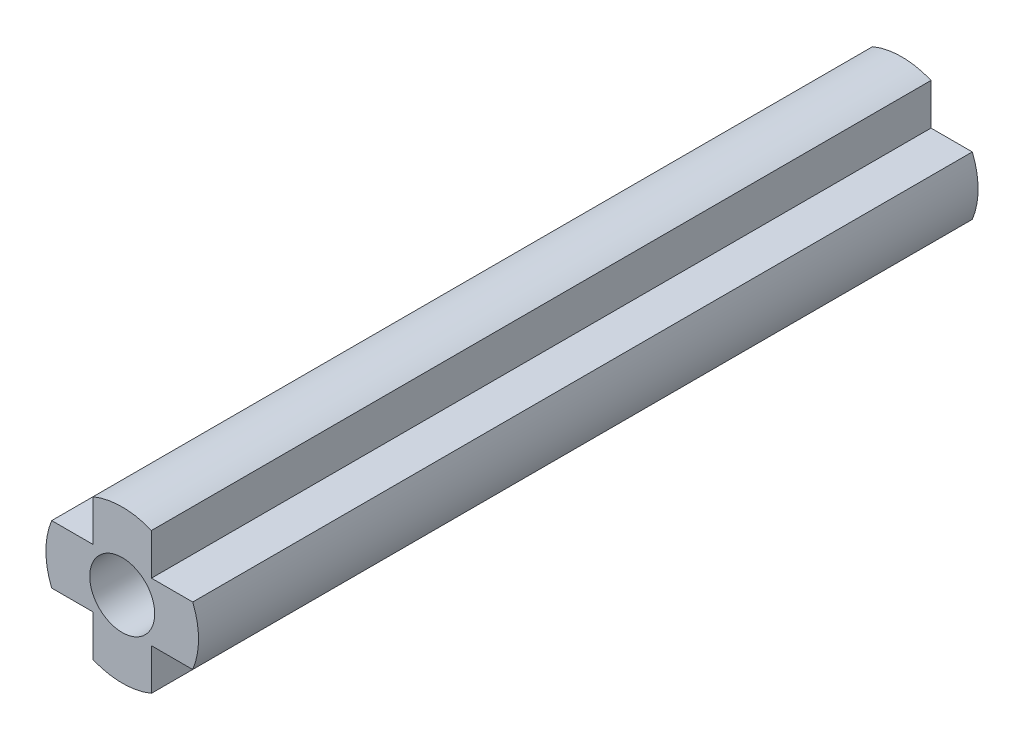
ISO-10303-21;
HEADER;
FILE_DESCRIPTION(('STEP AP214'),'2;1');
FILE_NAME('part.step','',(''),(''),'','','');
FILE_SCHEMA(('AUTOMOTIVE_DESIGN { 1 0 10303 214 1 1 1 1 }'));
ENDSEC;
DATA;
#1=APPLICATION_CONTEXT('core data for automotive mechanical design processes');
#2=APPLICATION_PROTOCOL_DEFINITION('international standard','automotive_design',2000,#1);
#3=PRODUCT_CONTEXT('',#1,'mechanical');
#4=PRODUCT('Part','Part','',(#3));
#5=PRODUCT_RELATED_PRODUCT_CATEGORY('part','',(#4));
#6=PRODUCT_DEFINITION_FORMATION('','',#4);
#7=PRODUCT_DEFINITION_CONTEXT('part definition',#1,'design');
#8=PRODUCT_DEFINITION('design','',#6,#7);
#9=PRODUCT_DEFINITION_SHAPE('','',#8);
#10=(LENGTH_UNIT() NAMED_UNIT(*) SI_UNIT(.MILLI.,.METRE.));
#11=(NAMED_UNIT(*) PLANE_ANGLE_UNIT() SI_UNIT($,.RADIAN.));
#12=(NAMED_UNIT(*) SI_UNIT($,.STERADIAN.) SOLID_ANGLE_UNIT());
#13=UNCERTAINTY_MEASURE_WITH_UNIT(LENGTH_MEASURE(1.E-05),#10,'distance_accuracy_value','');
#14=(GEOMETRIC_REPRESENTATION_CONTEXT(3) GLOBAL_UNCERTAINTY_ASSIGNED_CONTEXT((#13)) GLOBAL_UNIT_ASSIGNED_CONTEXT((#10,
#11,#12)) REPRESENTATION_CONTEXT('',''));
#15=CARTESIAN_POINT('',(0.,0.,0.));
#16=DIRECTION('',(0.,0.,1.));
#17=DIRECTION('',(1.,0.,0.));
#18=AXIS2_PLACEMENT_3D('',#15,#16,#17);
#19=CARTESIAN_POINT('',(-2.17082933460924,0.9,24.));
#20=DIRECTION('',(0.,-1.,0.));
#21=DIRECTION('',(0.,0.,-1.));
#22=AXIS2_PLACEMENT_3D('',#19,#20,#21);
#23=PLANE('',#22);
#24=DIRECTION('',(-1.,0.,0.));
#25=VECTOR('',#24,1.);
#26=CARTESIAN_POINT('',(-2.17082933460924,0.9,0.));
#27=LINE('',#26,#25);
#28=CARTESIAN_POINT('',(-0.9,0.9,0.));
#29=VERTEX_POINT('',#28);
#30=CARTESIAN_POINT('',(-2.17082933460924,0.9,0.));
#31=VERTEX_POINT('',#30);
#32=EDGE_CURVE('E153',#29,#31,#27,.T.);
#33=ORIENTED_EDGE('',*,*,#32,.T.);
#34=DIRECTION('',(0.,0.,-1.));
#35=VECTOR('',#34,1.);
#36=CARTESIAN_POINT('',(-2.17082933460924,0.9,24.));
#37=LINE('',#36,#35);
#38=CARTESIAN_POINT('',(-2.17082933460924,0.9,24.));
#39=VERTEX_POINT('',#38);
#40=EDGE_CURVE('E11',#39,#31,#37,.T.);
#41=ORIENTED_EDGE('',*,*,#40,.F.);
#42=DIRECTION('',(-1.,0.,0.));
#43=VECTOR('',#42,1.);
#44=CARTESIAN_POINT('',(-2.17082933460924,0.9,24.));
#45=LINE('',#44,#43);
#46=CARTESIAN_POINT('',(-0.9,0.9,24.));
#47=VERTEX_POINT('',#46);
#48=EDGE_CURVE('E176',#47,#39,#45,.T.);
#49=ORIENTED_EDGE('',*,*,#48,.F.);
#50=DIRECTION('',(0.,0.,-1.));
#51=VECTOR('',#50,1.);
#52=CARTESIAN_POINT('',(-0.9,0.9,24.));
#53=LINE('',#52,#51);
#54=EDGE_CURVE('E149',#47,#29,#53,.T.);
#55=ORIENTED_EDGE('',*,*,#54,.T.);
#56=EDGE_LOOP('',(#33,#41,#49,#55));
#57=FACE_BOUND('',#56,.T.);
#58=ADVANCED_FACE('F33',(#57),#23,.F.);
#59=CARTESIAN_POINT('',(0.,0.,24.));
#60=DIRECTION('',(0.,0.,-1.));
#61=DIRECTION('',(-1.,0.,0.));
#62=AXIS2_PLACEMENT_3D('',#59,#60,#61);
#63=CYLINDRICAL_SURFACE('',#62,2.35);
#64=CARTESIAN_POINT('',(0.,0.,0.));
#65=DIRECTION('',(0.,0.,1.));
#66=DIRECTION('',(1.,0.,0.));
#67=AXIS2_PLACEMENT_3D('',#64,#65,#66);
#68=CIRCLE('',#67,2.35);
#69=CARTESIAN_POINT('',(-2.17082933460924,-0.9,0.));
#70=VERTEX_POINT('',#69);
#71=EDGE_CURVE('E156',#31,#70,#68,.T.);
#72=ORIENTED_EDGE('',*,*,#71,.T.);
#73=DIRECTION('',(0.,0.,-1.));
#74=VECTOR('',#73,1.);
#75=CARTESIAN_POINT('',(-2.17082933460924,-0.9,24.));
#76=LINE('',#75,#74);
#77=CARTESIAN_POINT('',(-2.17082933460924,-0.9,24.));
#78=VERTEX_POINT('',#77);
#79=EDGE_CURVE('E41',#78,#70,#76,.T.);
#80=ORIENTED_EDGE('',*,*,#79,.F.);
#81=CARTESIAN_POINT('',(0.,0.,24.));
#82=DIRECTION('',(0.,0.,1.));
#83=DIRECTION('',(1.,0.,0.));
#84=AXIS2_PLACEMENT_3D('',#81,#82,#83);
#85=CIRCLE('',#84,2.35);
#86=EDGE_CURVE('E104',#39,#78,#85,.T.);
#87=ORIENTED_EDGE('',*,*,#86,.F.);
#88=ORIENTED_EDGE('',*,*,#40,.T.);
#89=EDGE_LOOP('',(#72,#80,#87,#88));
#90=FACE_BOUND('',#89,.T.);
#91=ADVANCED_FACE('F255',(#90),#63,.T.);
#92=CARTESIAN_POINT('',(-2.17082933460924,-0.9,24.));
#93=DIRECTION('',(0.,1.,0.));
#94=DIRECTION('',(-1.,0.,0.));
#95=AXIS2_PLACEMENT_3D('',#92,#93,#94);
#96=PLANE('',#95);
#97=DIRECTION('',(1.,0.,0.));
#98=VECTOR('',#97,1.);
#99=CARTESIAN_POINT('',(-2.17082933460924,-0.9,0.));
#100=LINE('',#99,#98);
#101=CARTESIAN_POINT('',(-0.9,-0.9,0.));
#102=VERTEX_POINT('',#101);
#103=EDGE_CURVE('E159',#70,#102,#100,.T.);
#104=ORIENTED_EDGE('',*,*,#103,.T.);
#105=DIRECTION('',(0.,0.,-1.));
#106=VECTOR('',#105,1.);
#107=CARTESIAN_POINT('',(-0.9,-0.9,24.));
#108=LINE('',#107,#106);
#109=CARTESIAN_POINT('',(-0.9,-0.9,24.));
#110=VERTEX_POINT('',#109);
#111=EDGE_CURVE('E195',#110,#102,#108,.T.);
#112=ORIENTED_EDGE('',*,*,#111,.F.);
#113=DIRECTION('',(1.,0.,0.));
#114=VECTOR('',#113,1.);
#115=CARTESIAN_POINT('',(-2.17082933460924,-0.9,24.));
#116=LINE('',#115,#114);
#117=EDGE_CURVE('E203',#78,#110,#116,.T.);
#118=ORIENTED_EDGE('',*,*,#117,.F.);
#119=ORIENTED_EDGE('',*,*,#79,.T.);
#120=EDGE_LOOP('',(#104,#112,#118,#119));
#121=FACE_BOUND('',#120,.T.);
#122=ADVANCED_FACE('F201',(#121),#96,.F.);
#123=CARTESIAN_POINT('',(-0.9,-0.9,24.));
#124=DIRECTION('',(1.,0.,0.));
#125=DIRECTION('',(0.,1.,0.));
#126=AXIS2_PLACEMENT_3D('',#123,#124,#125);
#127=PLANE('',#126);
#128=DIRECTION('',(0.,-1.,0.));
#129=VECTOR('',#128,1.);
#130=CARTESIAN_POINT('',(-0.9,-0.9,0.));
#131=LINE('',#130,#129);
#132=CARTESIAN_POINT('',(-0.900000000000001,-2.17082933460924,0.));
#133=VERTEX_POINT('',#132);
#134=EDGE_CURVE('E161',#102,#133,#131,.T.);
#135=ORIENTED_EDGE('',*,*,#134,.T.);
#136=DIRECTION('',(0.,0.,-1.));
#137=VECTOR('',#136,1.);
#138=CARTESIAN_POINT('',(-0.900000000000001,-2.17082933460924,24.));
#139=LINE('',#138,#137);
#140=CARTESIAN_POINT('',(-0.900000000000001,-2.17082933460924,24.));
#141=VERTEX_POINT('',#140);
#142=EDGE_CURVE('E192',#141,#133,#139,.T.);
#143=ORIENTED_EDGE('',*,*,#142,.F.);
#144=DIRECTION('',(0.,-1.,0.));
#145=VECTOR('',#144,1.);
#146=CARTESIAN_POINT('',(-0.9,-0.9,24.));
#147=LINE('',#146,#145);
#148=EDGE_CURVE('E221',#110,#141,#147,.T.);
#149=ORIENTED_EDGE('',*,*,#148,.F.);
#150=ORIENTED_EDGE('',*,*,#111,.T.);
#151=EDGE_LOOP('',(#135,#143,#149,#150));
#152=FACE_BOUND('',#151,.T.);
#153=ADVANCED_FACE('F212',(#152),#127,.F.);
#154=CARTESIAN_POINT('',(0.,0.,24.));
#155=DIRECTION('',(0.,0.,-1.));
#156=DIRECTION('',(-1.,0.,0.));
#157=AXIS2_PLACEMENT_3D('',#154,#155,#156);
#158=CYLINDRICAL_SURFACE('',#157,2.35);
#159=CARTESIAN_POINT('',(0.,0.,0.));
#160=DIRECTION('',(0.,0.,1.));
#161=DIRECTION('',(1.,0.,0.));
#162=AXIS2_PLACEMENT_3D('',#159,#160,#161);
#163=CIRCLE('',#162,2.35);
#164=CARTESIAN_POINT('',(0.9,-2.17082933460924,0.));
#165=VERTEX_POINT('',#164);
#166=EDGE_CURVE('E163',#133,#165,#163,.T.);
#167=ORIENTED_EDGE('',*,*,#166,.T.);
#168=DIRECTION('',(0.,0.,-1.));
#169=VECTOR('',#168,1.);
#170=CARTESIAN_POINT('',(0.9,-2.17082933460924,24.));
#171=LINE('',#170,#169);
#172=CARTESIAN_POINT('',(0.9,-2.17082933460924,24.));
#173=VERTEX_POINT('',#172);
#174=EDGE_CURVE('E189',#173,#165,#171,.T.);
#175=ORIENTED_EDGE('',*,*,#174,.F.);
#176=CARTESIAN_POINT('',(0.,0.,24.));
#177=DIRECTION('',(0.,0.,1.));
#178=DIRECTION('',(1.,0.,0.));
#179=AXIS2_PLACEMENT_3D('',#176,#177,#178);
#180=CIRCLE('',#179,2.35);
#181=EDGE_CURVE('E218',#141,#173,#180,.T.);
#182=ORIENTED_EDGE('',*,*,#181,.F.);
#183=ORIENTED_EDGE('',*,*,#142,.T.);
#184=EDGE_LOOP('',(#167,#175,#182,#183));
#185=FACE_BOUND('',#184,.T.);
#186=ADVANCED_FACE('F216',(#185),#158,.T.);
#187=CARTESIAN_POINT('',(0.9,-0.9,24.));
#188=DIRECTION('',(-1.,0.,0.));
#189=DIRECTION('',(0.,-1.,0.));
#190=AXIS2_PLACEMENT_3D('',#187,#188,#189);
#191=PLANE('',#190);
#192=DIRECTION('',(0.,1.,0.));
#193=VECTOR('',#192,1.);
#194=CARTESIAN_POINT('',(0.9,-0.9,0.));
#195=LINE('',#194,#193);
#196=CARTESIAN_POINT('',(0.9,-0.9,0.));
#197=VERTEX_POINT('',#196);
#198=EDGE_CURVE('E165',#165,#197,#195,.T.);
#199=ORIENTED_EDGE('',*,*,#198,.T.);
#200=DIRECTION('',(0.,0.,-1.));
#201=VECTOR('',#200,1.);
#202=CARTESIAN_POINT('',(0.9,-0.9,24.));
#203=LINE('',#202,#201);
#204=CARTESIAN_POINT('',(0.9,-0.9,24.));
#205=VERTEX_POINT('',#204);
#206=EDGE_CURVE('E186',#205,#197,#203,.T.);
#207=ORIENTED_EDGE('',*,*,#206,.F.);
#208=DIRECTION('',(0.,1.,0.));
#209=VECTOR('',#208,1.);
#210=CARTESIAN_POINT('',(0.9,-0.9,24.));
#211=LINE('',#210,#209);
#212=EDGE_CURVE('E220',#173,#205,#211,.T.);
#213=ORIENTED_EDGE('',*,*,#212,.F.);
#214=ORIENTED_EDGE('',*,*,#174,.T.);
#215=EDGE_LOOP('',(#199,#207,#213,#214));
#216=FACE_BOUND('',#215,.T.);
#217=ADVANCED_FACE('F268',(#216),#191,.F.);
#218=CARTESIAN_POINT('',(0.9,-0.9,24.));
#219=DIRECTION('',(0.,1.,0.));
#220=DIRECTION('',(-1.,0.,0.));
#221=AXIS2_PLACEMENT_3D('',#218,#219,#220);
#222=PLANE('',#221);
#223=DIRECTION('',(1.,0.,0.));
#224=VECTOR('',#223,1.);
#225=CARTESIAN_POINT('',(0.9,-0.9,0.));
#226=LINE('',#225,#224);
#227=CARTESIAN_POINT('',(2.17082933460924,-0.900000000000001,0.));
#228=VERTEX_POINT('',#227);
#229=EDGE_CURVE('E167',#197,#228,#226,.T.);
#230=ORIENTED_EDGE('',*,*,#229,.T.);
#231=DIRECTION('',(0.,0.,-1.));
#232=VECTOR('',#231,1.);
#233=CARTESIAN_POINT('',(2.17082933460924,-0.900000000000001,24.));
#234=LINE('',#233,#232);
#235=CARTESIAN_POINT('',(2.17082933460924,-0.900000000000001,24.));
#236=VERTEX_POINT('',#235);
#237=EDGE_CURVE('E183',#236,#228,#234,.T.);
#238=ORIENTED_EDGE('',*,*,#237,.F.);
#239=DIRECTION('',(1.,0.,0.));
#240=VECTOR('',#239,1.);
#241=CARTESIAN_POINT('',(0.9,-0.9,24.));
#242=LINE('',#241,#240);
#243=EDGE_CURVE('E223',#205,#236,#242,.T.);
#244=ORIENTED_EDGE('',*,*,#243,.F.);
#245=ORIENTED_EDGE('',*,*,#206,.T.);
#246=EDGE_LOOP('',(#230,#238,#244,#245));
#247=FACE_BOUND('',#246,.T.);
#248=ADVANCED_FACE('F271',(#247),#222,.F.);
#249=CARTESIAN_POINT('',(0.,0.,24.));
#250=DIRECTION('',(0.,0.,-1.));
#251=DIRECTION('',(-1.,0.,0.));
#252=AXIS2_PLACEMENT_3D('',#249,#250,#251);
#253=CYLINDRICAL_SURFACE('',#252,2.35);
#254=CARTESIAN_POINT('',(0.,0.,0.));
#255=DIRECTION('',(0.,0.,1.));
#256=DIRECTION('',(1.,0.,0.));
#257=AXIS2_PLACEMENT_3D('',#254,#255,#256);
#258=CIRCLE('',#257,2.35);
#259=CARTESIAN_POINT('',(2.17082933460924,0.9,0.));
#260=VERTEX_POINT('',#259);
#261=EDGE_CURVE('E169',#228,#260,#258,.T.);
#262=ORIENTED_EDGE('',*,*,#261,.T.);
#263=DIRECTION('',(0.,0.,-1.));
#264=VECTOR('',#263,1.);
#265=CARTESIAN_POINT('',(2.17082933460924,0.9,24.));
#266=LINE('',#265,#264);
#267=CARTESIAN_POINT('',(2.17082933460924,0.9,24.));
#268=VERTEX_POINT('',#267);
#269=EDGE_CURVE('E180',#268,#260,#266,.T.);
#270=ORIENTED_EDGE('',*,*,#269,.F.);
#271=CARTESIAN_POINT('',(0.,0.,24.));
#272=DIRECTION('',(0.,0.,1.));
#273=DIRECTION('',(1.,0.,0.));
#274=AXIS2_PLACEMENT_3D('',#271,#272,#273);
#275=CIRCLE('',#274,2.35);
#276=EDGE_CURVE('E229',#236,#268,#275,.T.);
#277=ORIENTED_EDGE('',*,*,#276,.F.);
#278=ORIENTED_EDGE('',*,*,#237,.T.);
#279=EDGE_LOOP('',(#262,#270,#277,#278));
#280=FACE_BOUND('',#279,.T.);
#281=ADVANCED_FACE('F235',(#280),#253,.T.);
#282=CARTESIAN_POINT('',(0.9,0.9,24.));
#283=DIRECTION('',(0.,-1.,0.));
#284=DIRECTION('',(0.,0.,-1.));
#285=AXIS2_PLACEMENT_3D('',#282,#283,#284);
#286=PLANE('',#285);
#287=DIRECTION('',(-1.,0.,0.));
#288=VECTOR('',#287,1.);
#289=CARTESIAN_POINT('',(0.9,0.9,0.));
#290=LINE('',#289,#288);
#291=CARTESIAN_POINT('',(0.9,0.9,0.));
#292=VERTEX_POINT('',#291);
#293=EDGE_CURVE('E171',#260,#292,#290,.T.);
#294=ORIENTED_EDGE('',*,*,#293,.T.);
#295=DIRECTION('',(0.,0.,-1.));
#296=VECTOR('',#295,1.);
#297=CARTESIAN_POINT('',(0.9,0.9,24.));
#298=LINE('',#297,#296);
#299=CARTESIAN_POINT('',(0.9,0.9,24.));
#300=VERTEX_POINT('',#299);
#301=EDGE_CURVE('E144',#300,#292,#298,.T.);
#302=ORIENTED_EDGE('',*,*,#301,.F.);
#303=DIRECTION('',(-1.,0.,0.));
#304=VECTOR('',#303,1.);
#305=CARTESIAN_POINT('',(0.9,0.9,24.));
#306=LINE('',#305,#304);
#307=EDGE_CURVE('E135',#268,#300,#306,.T.);
#308=ORIENTED_EDGE('',*,*,#307,.F.);
#309=ORIENTED_EDGE('',*,*,#269,.T.);
#310=EDGE_LOOP('',(#294,#302,#308,#309));
#311=FACE_BOUND('',#310,.T.);
#312=ADVANCED_FACE('F239',(#311),#286,.F.);
#313=CARTESIAN_POINT('',(0.9,2.17082933460924,24.));
#314=DIRECTION('',(-1.,0.,0.));
#315=DIRECTION('',(0.,-1.,0.));
#316=AXIS2_PLACEMENT_3D('',#313,#314,#315);
#317=PLANE('',#316);
#318=DIRECTION('',(0.,1.,0.));
#319=VECTOR('',#318,1.);
#320=CARTESIAN_POINT('',(0.9,2.17082933460924,0.));
#321=LINE('',#320,#319);
#322=CARTESIAN_POINT('',(0.9,2.17082933460924,0.));
#323=VERTEX_POINT('',#322);
#324=EDGE_CURVE('E143',#292,#323,#321,.T.);
#325=ORIENTED_EDGE('',*,*,#324,.T.);
#326=DIRECTION('',(0.,0.,-1.));
#327=VECTOR('',#326,1.);
#328=CARTESIAN_POINT('',(0.9,2.17082933460924,24.));
#329=LINE('',#328,#327);
#330=CARTESIAN_POINT('',(0.9,2.17082933460924,24.));
#331=VERTEX_POINT('',#330);
#332=EDGE_CURVE('E140',#331,#323,#329,.T.);
#333=ORIENTED_EDGE('',*,*,#332,.F.);
#334=DIRECTION('',(0.,1.,0.));
#335=VECTOR('',#334,1.);
#336=CARTESIAN_POINT('',(0.9,2.17082933460924,24.));
#337=LINE('',#336,#335);
#338=EDGE_CURVE('E129',#300,#331,#337,.T.);
#339=ORIENTED_EDGE('',*,*,#338,.F.);
#340=ORIENTED_EDGE('',*,*,#301,.T.);
#341=EDGE_LOOP('',(#325,#333,#339,#340));
#342=FACE_BOUND('',#341,.T.);
#343=ADVANCED_FACE('F141',(#342),#317,.F.);
#344=CARTESIAN_POINT('',(0.,0.,24.));
#345=DIRECTION('',(0.,0.,-1.));
#346=DIRECTION('',(-1.,0.,0.));
#347=AXIS2_PLACEMENT_3D('',#344,#345,#346);
#348=CYLINDRICAL_SURFACE('',#347,2.35);
#349=CARTESIAN_POINT('',(0.,0.,0.));
#350=DIRECTION('',(0.,0.,1.));
#351=DIRECTION('',(1.,0.,0.));
#352=AXIS2_PLACEMENT_3D('',#349,#350,#351);
#353=CIRCLE('',#352,2.35);
#354=CARTESIAN_POINT('',(-0.9,2.17082933460924,0.));
#355=VERTEX_POINT('',#354);
#356=EDGE_CURVE('E90',#323,#355,#353,.T.);
#357=ORIENTED_EDGE('',*,*,#356,.T.);
#358=DIRECTION('',(0.,0.,-1.));
#359=VECTOR('',#358,1.);
#360=CARTESIAN_POINT('',(-0.9,2.17082933460924,24.));
#361=LINE('',#360,#359);
#362=CARTESIAN_POINT('',(-0.9,2.17082933460924,24.));
#363=VERTEX_POINT('',#362);
#364=EDGE_CURVE('E145',#363,#355,#361,.T.);
#365=ORIENTED_EDGE('',*,*,#364,.F.);
#366=CARTESIAN_POINT('',(0.,0.,24.));
#367=DIRECTION('',(0.,0.,1.));
#368=DIRECTION('',(1.,0.,0.));
#369=AXIS2_PLACEMENT_3D('',#366,#367,#368);
#370=CIRCLE('',#369,2.35);
#371=EDGE_CURVE('E133',#331,#363,#370,.T.);
#372=ORIENTED_EDGE('',*,*,#371,.F.);
#373=ORIENTED_EDGE('',*,*,#332,.T.);
#374=EDGE_LOOP('',(#357,#365,#372,#373));
#375=FACE_BOUND('',#374,.T.);
#376=ADVANCED_FACE('F147',(#375),#348,.T.);
#377=CARTESIAN_POINT('',(-0.9,2.17082933460924,24.));
#378=DIRECTION('',(1.,0.,0.));
#379=DIRECTION('',(0.,1.,0.));
#380=AXIS2_PLACEMENT_3D('',#377,#378,#379);
#381=PLANE('',#380);
#382=DIRECTION('',(0.,-1.,0.));
#383=VECTOR('',#382,1.);
#384=CARTESIAN_POINT('',(-0.9,2.17082933460924,0.));
#385=LINE('',#384,#383);
#386=EDGE_CURVE('E96',#355,#29,#385,.T.);
#387=ORIENTED_EDGE('',*,*,#386,.T.);
#388=ORIENTED_EDGE('',*,*,#54,.F.);
#389=DIRECTION('',(0.,-1.,0.));
#390=VECTOR('',#389,1.);
#391=CARTESIAN_POINT('',(-0.9,2.17082933460924,24.));
#392=LINE('',#391,#390);
#393=EDGE_CURVE('E49',#363,#47,#392,.T.);
#394=ORIENTED_EDGE('',*,*,#393,.F.);
#395=ORIENTED_EDGE('',*,*,#364,.T.);
#396=EDGE_LOOP('',(#387,#388,#394,#395));
#397=FACE_BOUND('',#396,.T.);
#398=ADVANCED_FACE('F243',(#397),#381,.F.);
#399=CARTESIAN_POINT('',(0.,0.,24.));
#400=DIRECTION('',(0.,0.,1.));
#401=DIRECTION('',(1.,0.,0.));
#402=AXIS2_PLACEMENT_3D('',#399,#400,#401);
#403=PLANE('',#402);
#404=CARTESIAN_POINT('',(0.,0.,24.));
#405=DIRECTION('',(0.,0.,1.));
#406=DIRECTION('',(1.,0.,0.));
#407=AXIS2_PLACEMENT_3D('',#404,#405,#406);
#408=CIRCLE('',#407,1.);
#409=CARTESIAN_POINT('',(1.,0.,24.));
#410=VERTEX_POINT('',#409);
#411=EDGE_CURVE('E332',#410,#410,#408,.T.);
#412=ORIENTED_EDGE('',*,*,#411,.F.);
#413=EDGE_LOOP('',(#412));
#414=FACE_BOUND('',#413,.T.);
#415=ORIENTED_EDGE('',*,*,#48,.T.);
#416=ORIENTED_EDGE('',*,*,#86,.T.);
#417=ORIENTED_EDGE('',*,*,#117,.T.);
#418=ORIENTED_EDGE('',*,*,#148,.T.);
#419=ORIENTED_EDGE('',*,*,#181,.T.);
#420=ORIENTED_EDGE('',*,*,#212,.T.);
#421=ORIENTED_EDGE('',*,*,#243,.T.);
#422=ORIENTED_EDGE('',*,*,#276,.T.);
#423=ORIENTED_EDGE('',*,*,#307,.T.);
#424=ORIENTED_EDGE('',*,*,#338,.T.);
#425=ORIENTED_EDGE('',*,*,#371,.T.);
#426=ORIENTED_EDGE('',*,*,#393,.T.);
#427=EDGE_LOOP('',(#415,#416,#417,#418,#419,#420,#421,#422,#423,#424,#425,#426));
#428=FACE_BOUND('',#427,.T.);
#429=ADVANCED_FACE('F131',(#414,#428),#403,.T.);
#430=CARTESIAN_POINT('',(0.,0.,0.));
#431=DIRECTION('',(0.,0.,1.));
#432=DIRECTION('',(1.,0.,0.));
#433=AXIS2_PLACEMENT_3D('',#430,#431,#432);
#434=PLANE('',#433);
#435=ORIENTED_EDGE('',*,*,#32,.F.);
#436=ORIENTED_EDGE('',*,*,#386,.F.);
#437=ORIENTED_EDGE('',*,*,#356,.F.);
#438=ORIENTED_EDGE('',*,*,#324,.F.);
#439=ORIENTED_EDGE('',*,*,#293,.F.);
#440=ORIENTED_EDGE('',*,*,#261,.F.);
#441=ORIENTED_EDGE('',*,*,#229,.F.);
#442=ORIENTED_EDGE('',*,*,#198,.F.);
#443=ORIENTED_EDGE('',*,*,#166,.F.);
#444=ORIENTED_EDGE('',*,*,#134,.F.);
#445=ORIENTED_EDGE('',*,*,#103,.F.);
#446=ORIENTED_EDGE('',*,*,#71,.F.);
#447=EDGE_LOOP('',(#435,#436,#437,#438,#439,#440,#441,#442,#443,#444,#445,#446));
#448=FACE_BOUND('',#447,.T.);
#449=ADVANCED_FACE('F207',(#448),#434,.F.);
#450=CARTESIAN_POINT('',(0.,0.,11.));
#451=DIRECTION('',(0.,0.,1.));
#452=DIRECTION('',(1.,0.,0.));
#453=AXIS2_PLACEMENT_3D('',#450,#451,#452);
#454=CYLINDRICAL_SURFACE('',#453,1.);
#455=CARTESIAN_POINT('',(0.,0.,11.));
#456=DIRECTION('',(0.,0.,1.));
#457=DIRECTION('',(1.,0.,0.));
#458=AXIS2_PLACEMENT_3D('',#455,#456,#457);
#459=CIRCLE('',#458,1.);
#460=CARTESIAN_POINT('',(1.,0.,11.));
#461=VERTEX_POINT('',#460);
#462=EDGE_CURVE('E157',#461,#461,#459,.T.);
#463=CARTESIAN_POINT('',(1.,0.,11.));
#464=CARTESIAN_POINT('',(1.,0.,11.1354166666667));
#465=CARTESIAN_POINT('',(1.,0.,11.2708333333333));
#466=CARTESIAN_POINT('',(1.,0.,11.5416666666667));
#467=CARTESIAN_POINT('',(1.,0.,11.6770833333333));
#468=CARTESIAN_POINT('',(1.,0.,11.9479166666667));
#469=CARTESIAN_POINT('',(1.,0.,12.0833333333333));
#470=CARTESIAN_POINT('',(1.,0.,12.3541666666667));
#471=CARTESIAN_POINT('',(1.,0.,12.4895833333333));
#472=CARTESIAN_POINT('',(1.,0.,12.7604166666667));
#473=CARTESIAN_POINT('',(1.,0.,12.8958333333333));
#474=CARTESIAN_POINT('',(1.,0.,13.1666666666667));
#475=CARTESIAN_POINT('',(1.,0.,13.3020833333333));
#476=CARTESIAN_POINT('',(1.,0.,13.5729166666667));
#477=CARTESIAN_POINT('',(1.,0.,13.7083333333333));
#478=CARTESIAN_POINT('',(1.,0.,13.9791666666667));
#479=CARTESIAN_POINT('',(1.,0.,14.1145833333333));
#480=CARTESIAN_POINT('',(1.,0.,14.3854166666667));
#481=CARTESIAN_POINT('',(1.,0.,14.5208333333333));
#482=CARTESIAN_POINT('',(1.,0.,14.7916666666667));
#483=CARTESIAN_POINT('',(1.,0.,14.9270833333333));
#484=CARTESIAN_POINT('',(1.,0.,15.1979166666667));
#485=CARTESIAN_POINT('',(1.,0.,15.3333333333333));
#486=CARTESIAN_POINT('',(1.,0.,15.6041666666667));
#487=CARTESIAN_POINT('',(1.,0.,15.7395833333333));
#488=CARTESIAN_POINT('',(1.,0.,16.0104166666667));
#489=CARTESIAN_POINT('',(1.,0.,16.1458333333333));
#490=CARTESIAN_POINT('',(1.,0.,16.4166666666667));
#491=CARTESIAN_POINT('',(1.,0.,16.5520833333333));
#492=CARTESIAN_POINT('',(1.,0.,16.8229166666667));
#493=CARTESIAN_POINT('',(1.,0.,16.9583333333333));
#494=CARTESIAN_POINT('',(1.,0.,17.2291666666667));
#495=CARTESIAN_POINT('',(1.,0.,17.3645833333333));
#496=CARTESIAN_POINT('',(1.,0.,17.6354166666667));
#497=CARTESIAN_POINT('',(1.,0.,17.7708333333333));
#498=CARTESIAN_POINT('',(1.,0.,18.0416666666667));
#499=CARTESIAN_POINT('',(1.,0.,18.1770833333333));
#500=CARTESIAN_POINT('',(1.,0.,18.4479166666667));
#501=CARTESIAN_POINT('',(1.,0.,18.5833333333333));
#502=CARTESIAN_POINT('',(1.,0.,18.8541666666667));
#503=CARTESIAN_POINT('',(1.,0.,18.9895833333333));
#504=CARTESIAN_POINT('',(1.,0.,19.2604166666667));
#505=CARTESIAN_POINT('',(1.,0.,19.3958333333333));
#506=CARTESIAN_POINT('',(1.,0.,19.6666666666667));
#507=CARTESIAN_POINT('',(1.,0.,19.8020833333333));
#508=CARTESIAN_POINT('',(1.,0.,20.0729166666667));
#509=CARTESIAN_POINT('',(1.,0.,20.2083333333333));
#510=CARTESIAN_POINT('',(1.,0.,20.4791666666667));
#511=CARTESIAN_POINT('',(1.,0.,20.6145833333333));
#512=CARTESIAN_POINT('',(1.,0.,20.8854166666667));
#513=CARTESIAN_POINT('',(1.,0.,21.0208333333333));
#514=CARTESIAN_POINT('',(1.,0.,21.2916666666667));
#515=CARTESIAN_POINT('',(1.,0.,21.4270833333333));
#516=CARTESIAN_POINT('',(1.,0.,21.6979166666667));
#517=CARTESIAN_POINT('',(1.,0.,21.8333333333333));
#518=CARTESIAN_POINT('',(1.,0.,22.1041666666667));
#519=CARTESIAN_POINT('',(1.,0.,22.2395833333333));
#520=CARTESIAN_POINT('',(1.,0.,22.5104166666667));
#521=CARTESIAN_POINT('',(1.,0.,22.6458333333333));
#522=CARTESIAN_POINT('',(1.,0.,22.9166666666667));
#523=CARTESIAN_POINT('',(1.,0.,23.0520833333333));
#524=CARTESIAN_POINT('',(1.,0.,23.3229166666667));
#525=CARTESIAN_POINT('',(1.,0.,23.4583333333333));
#526=CARTESIAN_POINT('',(1.,0.,23.7291666666667));
#527=CARTESIAN_POINT('',(1.,0.,23.8645833333333));
#528=CARTESIAN_POINT('',(1.,0.,24.));
#529=B_SPLINE_CURVE_WITH_KNOTS('',3,(#463,#464,#465,#466,#467,#468,#469,#470,#471,#472,#473,
#474,#475,#476,#477,#478,#479,#480,#481,#482,#483,#484,#485,#486,#487,#488,#489,#490,#491,#492,
#493,#494,#495,#496,#497,#498,#499,#500,#501,#502,#503,#504,#505,#506,#507,#508,#509,#510,#511,
#512,#513,#514,#515,#516,#517,#518,#519,#520,#521,#522,#523,#524,#525,#526,#527,#528),
.UNSPECIFIED.,.F.,.F.,(4,2,2,2,2,2,2,2,2,2,2,2,2,2,2,2,2,2,2,2,2,2,2,2,2,2,2,2,2,2,2,2,4),(0.,
0.40625,0.812500000000001,1.21875,1.625,2.03125,2.4375,2.84375,3.25,3.65625,4.0625,4.46875,
4.875,5.28125,5.6875,6.09375,6.5,6.90625,7.3125,7.71875,8.125,8.53125,8.9375,9.34375,9.75,
10.15625,10.5625,10.96875,11.375,11.78125,12.1875,12.59375,13.),.UNSPECIFIED.);
#530=EDGE_CURVE('BSEAM303',#461,#410,#529,.T.);
#531=ORIENTED_EDGE('',*,*,#462,.F.);
#532=ORIENTED_EDGE('',*,*,#411,.T.);
#533=ORIENTED_EDGE('',*,*,#530,.T.);
#534=ORIENTED_EDGE('',*,*,#530,.F.);
#535=EDGE_LOOP('',(#531,#533,#532,#534));
#536=FACE_BOUND('',#535,.T.);
#537=ADVANCED_FACE('F303',(#536),#454,.F.);
#538=CARTESIAN_POINT('',(0.,0.,11.));
#539=DIRECTION('',(0.,0.,1.));
#540=DIRECTION('',(1.,0.,0.));
#541=AXIS2_PLACEMENT_3D('',#538,#539,#540);
#542=PLANE('',#541);
#543=ORIENTED_EDGE('',*,*,#462,.T.);
#544=EDGE_LOOP('',(#543));
#545=FACE_BOUND('',#544,.T.);
#546=ADVANCED_FACE('F316',(#545),#542,.T.);
#547=CLOSED_SHELL('',(#58,#91,#122,#153,#186,#217,#248,#281,#312,#343,#376,#398,#429,#449,#537,#546));
#548=MANIFOLD_SOLID_BREP('B2',#547);
#549=ADVANCED_BREP_SHAPE_REPRESENTATION('',(#18,#548),#14);
#550=SHAPE_DEFINITION_REPRESENTATION(#9,#549);
ENDSEC;
END-ISO-10303-21;
